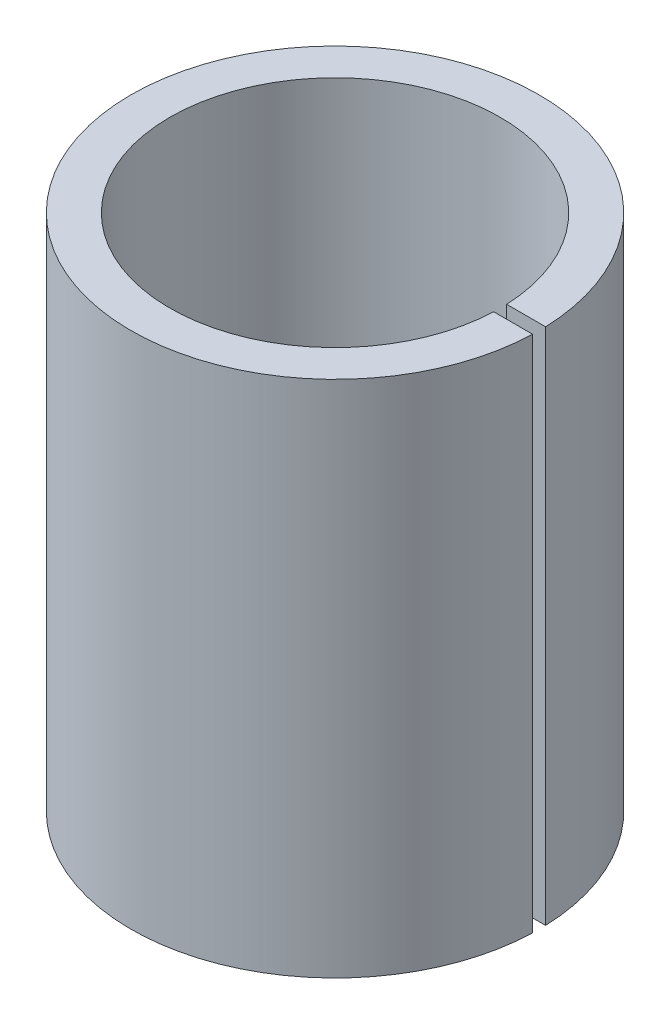
ISO-10303-21;
HEADER;
FILE_DESCRIPTION(('STEP AP214'),'2;1');
FILE_NAME('part.step','',(''),(''),'','','');
FILE_SCHEMA(('AUTOMOTIVE_DESIGN { 1 0 10303 214 1 1 1 1 }'));
ENDSEC;
DATA;
#1=APPLICATION_CONTEXT('core data for automotive mechanical design processes');
#2=APPLICATION_PROTOCOL_DEFINITION('international standard','automotive_design',2000,#1);
#3=PRODUCT_CONTEXT('',#1,'mechanical');
#4=PRODUCT('Part','Part','',(#3));
#5=PRODUCT_RELATED_PRODUCT_CATEGORY('part','',(#4));
#6=PRODUCT_DEFINITION_FORMATION('','',#4);
#7=PRODUCT_DEFINITION_CONTEXT('part definition',#1,'design');
#8=PRODUCT_DEFINITION('design','',#6,#7);
#9=PRODUCT_DEFINITION_SHAPE('','',#8);
#10=(LENGTH_UNIT() NAMED_UNIT(*) SI_UNIT(.MILLI.,.METRE.));
#11=(NAMED_UNIT(*) PLANE_ANGLE_UNIT() SI_UNIT($,.RADIAN.));
#12=(NAMED_UNIT(*) SI_UNIT($,.STERADIAN.) SOLID_ANGLE_UNIT());
#13=UNCERTAINTY_MEASURE_WITH_UNIT(LENGTH_MEASURE(1.E-05),#10,'distance_accuracy_value','');
#14=(GEOMETRIC_REPRESENTATION_CONTEXT(3) GLOBAL_UNCERTAINTY_ASSIGNED_CONTEXT((#13)) GLOBAL_UNIT_ASSIGNED_CONTEXT((#10,
#11,#12)) REPRESENTATION_CONTEXT('',''));
#15=CARTESIAN_POINT('',(0.,0.,0.));
#16=DIRECTION('',(0.,0.,1.));
#17=DIRECTION('',(1.,0.,0.));
#18=AXIS2_PLACEMENT_3D('',#15,#16,#17);
#19=CARTESIAN_POINT('',(3.15,8.,0.));
#20=DIRECTION('',(0.,1.,0.));
#21=DIRECTION('',(0.,0.,1.));
#22=AXIS2_PLACEMENT_3D('',#19,#20,#21);
#23=PLANE('',#22);
#24=CARTESIAN_POINT('',(0.,8.,0.));
#25=DIRECTION('',(0.,-1.,0.));
#26=DIRECTION('',(0.,0.,-1.));
#27=AXIS2_PLACEMENT_3D('',#24,#25,#26);
#28=CIRCLE('',#27,3.15);
#29=CARTESIAN_POINT('',(3.14841229828623,8.,0.1));
#30=VERTEX_POINT('',#29);
#31=CARTESIAN_POINT('',(3.14841229828623,8.,-0.1));
#32=VERTEX_POINT('',#31);
#33=EDGE_CURVE('E11',#30,#32,#28,.T.);
#34=ORIENTED_EDGE('',*,*,#33,.F.);
#35=DIRECTION('',(-1.,0.,0.));
#36=VECTOR('',#35,1.);
#37=CARTESIAN_POINT('',(6.3,8.,0.1));
#38=LINE('',#37,#36);
#39=CARTESIAN_POINT('',(2.54803846124818,8.,0.1));
#40=VERTEX_POINT('',#39);
#41=EDGE_CURVE('E25',#30,#40,#38,.T.);
#42=ORIENTED_EDGE('',*,*,#41,.T.);
#43=CARTESIAN_POINT('',(0.,8.,0.));
#44=DIRECTION('',(0.,-1.,0.));
#45=DIRECTION('',(0.,0.,-1.));
#46=AXIS2_PLACEMENT_3D('',#43,#44,#45);
#47=CIRCLE('',#46,2.55);
#48=CARTESIAN_POINT('',(2.54803846124818,8.,-0.1));
#49=VERTEX_POINT('',#48);
#50=EDGE_CURVE('E103',#40,#49,#47,.T.);
#51=ORIENTED_EDGE('',*,*,#50,.T.);
#52=DIRECTION('',(-1.,0.,0.));
#53=VECTOR('',#52,1.);
#54=CARTESIAN_POINT('',(6.3,8.,-0.1));
#55=LINE('',#54,#53);
#56=EDGE_CURVE('E98',#32,#49,#55,.T.);
#57=ORIENTED_EDGE('',*,*,#56,.F.);
#58=EDGE_LOOP('',(#34,#42,#51,#57));
#59=FACE_BOUND('',#58,.T.);
#60=ADVANCED_FACE('F17',(#59),#23,.T.);
#61=CARTESIAN_POINT('',(6.3,0.,-0.1));
#62=DIRECTION('',(0.,0.,1.));
#63=DIRECTION('',(1.,0.,0.));
#64=AXIS2_PLACEMENT_3D('',#61,#62,#63);
#65=PLANE('',#64);
#66=DIRECTION('',(-1.,0.,0.));
#67=VECTOR('',#66,1.);
#68=CARTESIAN_POINT('',(6.3,0.,-0.1));
#69=LINE('',#68,#67);
#70=CARTESIAN_POINT('',(3.14841229828623,0.,-0.1));
#71=VERTEX_POINT('',#70);
#72=CARTESIAN_POINT('',(2.54803846124818,0.,-0.1));
#73=VERTEX_POINT('',#72);
#74=EDGE_CURVE('E94',#71,#73,#69,.T.);
#75=ORIENTED_EDGE('',*,*,#74,.F.);
#76=DIRECTION('',(0.,-1.,0.));
#77=VECTOR('',#76,1.);
#78=CARTESIAN_POINT('',(3.14841229828623,0.,-0.1));
#79=LINE('',#78,#77);
#80=EDGE_CURVE('E72',#32,#71,#79,.T.);
#81=ORIENTED_EDGE('',*,*,#80,.F.);
#82=ORIENTED_EDGE('',*,*,#56,.T.);
#83=DIRECTION('',(0.,1.,0.));
#84=VECTOR('',#83,1.);
#85=CARTESIAN_POINT('',(2.54803846124818,0.,-0.1));
#86=LINE('',#85,#84);
#87=EDGE_CURVE('E86',#73,#49,#86,.T.);
#88=ORIENTED_EDGE('',*,*,#87,.F.);
#89=EDGE_LOOP('',(#75,#81,#82,#88));
#90=FACE_BOUND('',#89,.T.);
#91=ADVANCED_FACE('F115',(#90),#65,.T.);
#92=CARTESIAN_POINT('',(0.,0.,0.));
#93=DIRECTION('',(0.,-1.,0.));
#94=DIRECTION('',(1.,0.,0.));
#95=AXIS2_PLACEMENT_3D('',#92,#93,#94);
#96=CYLINDRICAL_SURFACE('',#95,2.55);
#97=ORIENTED_EDGE('',*,*,#50,.F.);
#98=DIRECTION('',(0.,-1.,0.));
#99=VECTOR('',#98,1.);
#100=CARTESIAN_POINT('',(2.54803846124818,0.,0.1));
#101=LINE('',#100,#99);
#102=CARTESIAN_POINT('',(2.54803846124818,0.,0.1));
#103=VERTEX_POINT('',#102);
#104=EDGE_CURVE('E82',#40,#103,#101,.T.);
#105=ORIENTED_EDGE('',*,*,#104,.T.);
#106=CARTESIAN_POINT('',(0.,0.,0.));
#107=DIRECTION('',(0.,-1.,0.));
#108=DIRECTION('',(0.,0.,-1.));
#109=AXIS2_PLACEMENT_3D('',#106,#107,#108);
#110=CIRCLE('',#109,2.55);
#111=EDGE_CURVE('E63',#103,#73,#110,.T.);
#112=ORIENTED_EDGE('',*,*,#111,.T.);
#113=ORIENTED_EDGE('',*,*,#87,.T.);
#114=EDGE_LOOP('',(#97,#105,#112,#113));
#115=FACE_BOUND('',#114,.T.);
#116=ADVANCED_FACE('F113',(#115),#96,.F.);
#117=CARTESIAN_POINT('',(2.55,0.,0.));
#118=DIRECTION('',(0.,-1.,0.));
#119=DIRECTION('',(0.,0.,-1.));
#120=AXIS2_PLACEMENT_3D('',#117,#118,#119);
#121=PLANE('',#120);
#122=ORIENTED_EDGE('',*,*,#111,.F.);
#123=DIRECTION('',(-1.,0.,0.));
#124=VECTOR('',#123,1.);
#125=CARTESIAN_POINT('',(6.3,0.,0.1));
#126=LINE('',#125,#124);
#127=CARTESIAN_POINT('',(3.14841229828623,0.,0.1));
#128=VERTEX_POINT('',#127);
#129=EDGE_CURVE('E55',#128,#103,#126,.T.);
#130=ORIENTED_EDGE('',*,*,#129,.F.);
#131=CARTESIAN_POINT('',(0.,0.,0.));
#132=DIRECTION('',(0.,-1.,0.));
#133=DIRECTION('',(0.,0.,-1.));
#134=AXIS2_PLACEMENT_3D('',#131,#132,#133);
#135=CIRCLE('',#134,3.15);
#136=EDGE_CURVE('E60',#128,#71,#135,.T.);
#137=ORIENTED_EDGE('',*,*,#136,.T.);
#138=ORIENTED_EDGE('',*,*,#74,.T.);
#139=EDGE_LOOP('',(#122,#130,#137,#138));
#140=FACE_BOUND('',#139,.T.);
#141=ADVANCED_FACE('F57',(#140),#121,.T.);
#142=CARTESIAN_POINT('',(0.,0.,0.));
#143=DIRECTION('',(0.,-1.,0.));
#144=DIRECTION('',(1.,0.,0.));
#145=AXIS2_PLACEMENT_3D('',#142,#143,#144);
#146=CYLINDRICAL_SURFACE('',#145,3.15);
#147=ORIENTED_EDGE('',*,*,#136,.F.);
#148=DIRECTION('',(0.,1.,0.));
#149=VECTOR('',#148,1.);
#150=CARTESIAN_POINT('',(3.14841229828623,0.,0.1));
#151=LINE('',#150,#149);
#152=EDGE_CURVE('E66',#128,#30,#151,.T.);
#153=ORIENTED_EDGE('',*,*,#152,.T.);
#154=ORIENTED_EDGE('',*,*,#33,.T.);
#155=ORIENTED_EDGE('',*,*,#80,.T.);
#156=EDGE_LOOP('',(#147,#153,#154,#155));
#157=FACE_BOUND('',#156,.T.);
#158=ADVANCED_FACE('F70',(#157),#146,.T.);
#159=CARTESIAN_POINT('',(6.3,8.,0.1));
#160=DIRECTION('',(0.,0.,-1.));
#161=DIRECTION('',(-1.,0.,0.));
#162=AXIS2_PLACEMENT_3D('',#159,#160,#161);
#163=PLANE('',#162);
#164=ORIENTED_EDGE('',*,*,#41,.F.);
#165=ORIENTED_EDGE('',*,*,#152,.F.);
#166=ORIENTED_EDGE('',*,*,#129,.T.);
#167=ORIENTED_EDGE('',*,*,#104,.F.);
#168=EDGE_LOOP('',(#164,#165,#166,#167));
#169=FACE_BOUND('',#168,.T.);
#170=ADVANCED_FACE('F67',(#169),#163,.T.);
#171=CLOSED_SHELL('',(#60,#91,#116,#141,#158,#170));
#172=MANIFOLD_SOLID_BREP('B1',#171);
#173=ADVANCED_BREP_SHAPE_REPRESENTATION('',(#18,#172),#14);
#174=SHAPE_DEFINITION_REPRESENTATION(#9,#173);
ENDSEC;
END-ISO-10303-21;
